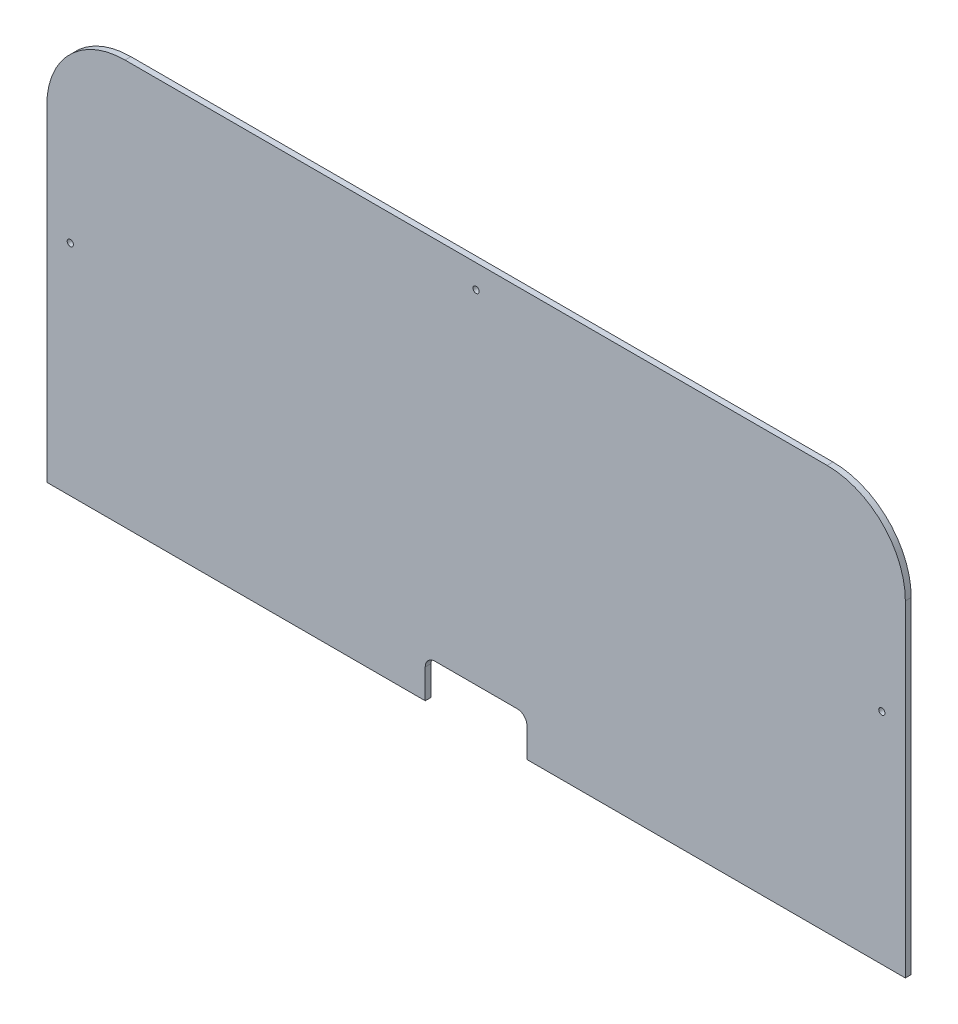
ISO-10303-21;
HEADER;
FILE_DESCRIPTION(('STEP AP214'),'2;1');
FILE_NAME('part.step','',(''),(''),'','','');
FILE_SCHEMA(('AUTOMOTIVE_DESIGN { 1 0 10303 214 1 1 1 1 }'));
ENDSEC;
DATA;
#1=APPLICATION_CONTEXT('core data for automotive mechanical design processes');
#2=APPLICATION_PROTOCOL_DEFINITION('international standard','automotive_design',2000,#1);
#3=PRODUCT_CONTEXT('',#1,'mechanical');
#4=PRODUCT('Part','Part','',(#3));
#5=PRODUCT_RELATED_PRODUCT_CATEGORY('part','',(#4));
#6=PRODUCT_DEFINITION_FORMATION('','',#4);
#7=PRODUCT_DEFINITION_CONTEXT('part definition',#1,'design');
#8=PRODUCT_DEFINITION('design','',#6,#7);
#9=PRODUCT_DEFINITION_SHAPE('','',#8);
#10=(LENGTH_UNIT() NAMED_UNIT(*) SI_UNIT(.MILLI.,.METRE.));
#11=(NAMED_UNIT(*) PLANE_ANGLE_UNIT() SI_UNIT($,.RADIAN.));
#12=(NAMED_UNIT(*) SI_UNIT($,.STERADIAN.) SOLID_ANGLE_UNIT());
#13=UNCERTAINTY_MEASURE_WITH_UNIT(LENGTH_MEASURE(1.E-05),#10,'distance_accuracy_value','');
#14=(GEOMETRIC_REPRESENTATION_CONTEXT(3) GLOBAL_UNCERTAINTY_ASSIGNED_CONTEXT((#13)) GLOBAL_UNIT_ASSIGNED_CONTEXT((#10,
#11,#12)) REPRESENTATION_CONTEXT('',''));
#15=CARTESIAN_POINT('',(0.,0.,0.));
#16=DIRECTION('',(0.,0.,1.));
#17=DIRECTION('',(1.,0.,0.));
#18=AXIS2_PLACEMENT_3D('',#15,#16,#17);
#19=CARTESIAN_POINT('',(-219.5,-103.5,3.));
#20=DIRECTION('',(0.,1.,0.));
#21=DIRECTION('',(0.,0.,1.));
#22=AXIS2_PLACEMENT_3D('',#19,#20,#21);
#23=PLANE('',#22);
#24=DIRECTION('',(1.,0.,0.));
#25=VECTOR('',#24,1.);
#26=CARTESIAN_POINT('',(-219.5,-103.5,0.));
#27=LINE('',#26,#25);
#28=CARTESIAN_POINT('',(-219.5,-103.5,0.));
#29=VERTEX_POINT('',#28);
#30=CARTESIAN_POINT('',(-26.,-103.5,0.));
#31=VERTEX_POINT('',#30);
#32=EDGE_CURVE('E180',#29,#31,#27,.T.);
#33=ORIENTED_EDGE('',*,*,#32,.T.);
#34=DIRECTION('',(0.,0.,-1.));
#35=VECTOR('',#34,1.);
#36=CARTESIAN_POINT('',(-26.,-103.5,3.));
#37=LINE('',#36,#35);
#38=CARTESIAN_POINT('',(-26.,-103.5,3.));
#39=VERTEX_POINT('',#38);
#40=EDGE_CURVE('E166',#39,#31,#37,.T.);
#41=ORIENTED_EDGE('',*,*,#40,.F.);
#42=DIRECTION('',(1.,0.,0.));
#43=VECTOR('',#42,1.);
#44=CARTESIAN_POINT('',(-219.5,-103.5,3.));
#45=LINE('',#44,#43);
#46=CARTESIAN_POINT('',(-219.5,-103.5,3.));
#47=VERTEX_POINT('',#46);
#48=EDGE_CURVE('E142',#47,#39,#45,.T.);
#49=ORIENTED_EDGE('',*,*,#48,.F.);
#50=DIRECTION('',(0.,0.,-1.));
#51=VECTOR('',#50,1.);
#52=CARTESIAN_POINT('',(-219.5,-103.5,3.));
#53=LINE('',#52,#51);
#54=EDGE_CURVE('E199',#47,#29,#53,.T.);
#55=ORIENTED_EDGE('',*,*,#54,.T.);
#56=EDGE_LOOP('',(#33,#41,#49,#55));
#57=FACE_BOUND('',#56,.T.);
#58=ADVANCED_FACE('F33',(#57),#23,.F.);
#59=CARTESIAN_POINT('',(219.5,103.5,3.));
#60=DIRECTION('',(-1.,0.,0.));
#61=DIRECTION('',(0.,-1.,0.));
#62=AXIS2_PLACEMENT_3D('',#59,#60,#61);
#63=PLANE('',#62);
#64=DIRECTION('',(0.,1.,0.));
#65=VECTOR('',#64,1.);
#66=CARTESIAN_POINT('',(219.5,103.5,0.));
#67=LINE('',#66,#65);
#68=CARTESIAN_POINT('',(219.5,-103.5,0.));
#69=VERTEX_POINT('',#68);
#70=CARTESIAN_POINT('',(219.5,63.5,0.));
#71=VERTEX_POINT('',#70);
#72=EDGE_CURVE('E168',#69,#71,#67,.T.);
#73=ORIENTED_EDGE('',*,*,#72,.T.);
#74=DIRECTION('',(0.,0.,-1.));
#75=VECTOR('',#74,1.);
#76=CARTESIAN_POINT('',(219.5,63.5,3.));
#77=LINE('',#76,#75);
#78=CARTESIAN_POINT('',(219.5,63.5,3.));
#79=VERTEX_POINT('',#78);
#80=EDGE_CURVE('E11',#71,#79,#77,.F.);
#81=ORIENTED_EDGE('',*,*,#80,.T.);
#82=DIRECTION('',(0.,1.,0.));
#83=VECTOR('',#82,1.);
#84=CARTESIAN_POINT('',(219.5,103.5,3.));
#85=LINE('',#84,#83);
#86=CARTESIAN_POINT('',(219.5,-103.5,3.));
#87=VERTEX_POINT('',#86);
#88=EDGE_CURVE('E177',#87,#79,#85,.T.);
#89=ORIENTED_EDGE('',*,*,#88,.F.);
#90=DIRECTION('',(0.,0.,-1.));
#91=VECTOR('',#90,1.);
#92=CARTESIAN_POINT('',(219.5,-103.5,3.));
#93=LINE('',#92,#91);
#94=EDGE_CURVE('E187',#87,#69,#93,.T.);
#95=ORIENTED_EDGE('',*,*,#94,.T.);
#96=EDGE_LOOP('',(#73,#81,#89,#95));
#97=FACE_BOUND('',#96,.T.);
#98=ADVANCED_FACE('F237',(#97),#63,.F.);
#99=CARTESIAN_POINT('',(-219.5,103.5,3.));
#100=DIRECTION('',(0.,-1.,0.));
#101=DIRECTION('',(0.,0.,-1.));
#102=AXIS2_PLACEMENT_3D('',#99,#100,#101);
#103=PLANE('',#102);
#104=DIRECTION('',(-1.,0.,0.));
#105=VECTOR('',#104,1.);
#106=CARTESIAN_POINT('',(-219.5,103.5,0.));
#107=LINE('',#106,#105);
#108=CARTESIAN_POINT('',(179.5,103.5,0.));
#109=VERTEX_POINT('',#108);
#110=CARTESIAN_POINT('',(-179.5,103.5,0.));
#111=VERTEX_POINT('',#110);
#112=EDGE_CURVE('E189',#109,#111,#107,.T.);
#113=ORIENTED_EDGE('',*,*,#112,.T.);
#114=DIRECTION('',(0.,0.,-1.));
#115=VECTOR('',#114,1.);
#116=CARTESIAN_POINT('',(-179.5,103.5,3.));
#117=LINE('',#116,#115);
#118=CARTESIAN_POINT('',(-179.5,103.5,3.));
#119=VERTEX_POINT('',#118);
#120=EDGE_CURVE('E212',#111,#119,#117,.F.);
#121=ORIENTED_EDGE('',*,*,#120,.T.);
#122=DIRECTION('',(-1.,0.,0.));
#123=VECTOR('',#122,1.);
#124=CARTESIAN_POINT('',(-219.5,103.5,3.));
#125=LINE('',#124,#123);
#126=CARTESIAN_POINT('',(179.5,103.5,3.));
#127=VERTEX_POINT('',#126);
#128=EDGE_CURVE('E179',#127,#119,#125,.T.);
#129=ORIENTED_EDGE('',*,*,#128,.F.);
#130=DIRECTION('',(0.,0.,-1.));
#131=VECTOR('',#130,1.);
#132=CARTESIAN_POINT('',(179.5,103.5,3.));
#133=LINE('',#132,#131);
#134=EDGE_CURVE('E209',#127,#109,#133,.T.);
#135=ORIENTED_EDGE('',*,*,#134,.T.);
#136=EDGE_LOOP('',(#113,#121,#129,#135));
#137=FACE_BOUND('',#136,.T.);
#138=ADVANCED_FACE('F231',(#137),#103,.F.);
#139=CARTESIAN_POINT('',(-219.5,103.5,3.));
#140=DIRECTION('',(1.,0.,0.));
#141=DIRECTION('',(0.,0.,-1.));
#142=AXIS2_PLACEMENT_3D('',#139,#140,#141);
#143=PLANE('',#142);
#144=DIRECTION('',(0.,-1.,0.));
#145=VECTOR('',#144,1.);
#146=CARTESIAN_POINT('',(-219.5,103.5,3.));
#147=LINE('',#146,#145);
#148=CARTESIAN_POINT('',(-219.5,63.5,3.));
#149=VERTEX_POINT('',#148);
#150=EDGE_CURVE('E183',#149,#47,#147,.T.);
#151=ORIENTED_EDGE('',*,*,#150,.F.);
#152=DIRECTION('',(0.,0.,-1.));
#153=VECTOR('',#152,1.);
#154=CARTESIAN_POINT('',(-219.5,63.5,3.));
#155=LINE('',#154,#153);
#156=CARTESIAN_POINT('',(-219.5,63.5,0.));
#157=VERTEX_POINT('',#156);
#158=EDGE_CURVE('E202',#149,#157,#155,.T.);
#159=ORIENTED_EDGE('',*,*,#158,.T.);
#160=DIRECTION('',(0.,-1.,0.));
#161=VECTOR('',#160,1.);
#162=CARTESIAN_POINT('',(-219.5,103.5,0.));
#163=LINE('',#162,#161);
#164=EDGE_CURVE('E192',#157,#29,#163,.T.);
#165=ORIENTED_EDGE('',*,*,#164,.T.);
#166=ORIENTED_EDGE('',*,*,#54,.F.);
#167=EDGE_LOOP('',(#151,#159,#165,#166));
#168=FACE_BOUND('',#167,.T.);
#169=ADVANCED_FACE('F223',(#168),#143,.F.);
#170=CARTESIAN_POINT('',(26.,-103.5,3.));
#171=VERTEX_POINT('',#170);
#172=EDGE_CURVE('E185',#171,#87,#45,.T.);
#173=ORIENTED_EDGE('',*,*,#172,.F.);
#174=DIRECTION('',(0.,0.,-1.));
#175=VECTOR('',#174,1.);
#176=CARTESIAN_POINT('',(26.,-103.5,3.));
#177=LINE('',#176,#175);
#178=CARTESIAN_POINT('',(26.,-103.5,0.));
#179=VERTEX_POINT('',#178);
#180=EDGE_CURVE('E169',#171,#179,#177,.T.);
#181=ORIENTED_EDGE('',*,*,#180,.T.);
#182=EDGE_CURVE('E194',#179,#69,#27,.T.);
#183=ORIENTED_EDGE('',*,*,#182,.T.);
#184=ORIENTED_EDGE('',*,*,#94,.F.);
#185=EDGE_LOOP('',(#173,#181,#183,#184));
#186=FACE_BOUND('',#185,.T.);
#187=ADVANCED_FACE('F241',(#186),#23,.F.);
#188=CARTESIAN_POINT('',(0.,0.,3.));
#189=DIRECTION('',(0.,0.,1.));
#190=DIRECTION('',(1.,0.,0.));
#191=AXIS2_PLACEMENT_3D('',#188,#189,#190);
#192=PLANE('',#191);
#193=CARTESIAN_POINT('',(-1.41735333110377E-13,91.5000000000001,3.));
#194=DIRECTION('',(0.,0.,1.));
#195=DIRECTION('',(1.,0.,0.));
#196=AXIS2_PLACEMENT_3D('',#193,#194,#195);
#197=CIRCLE('',#196,1.60000000000001);
#198=CARTESIAN_POINT('',(1.59999999999987,91.5000000000001,3.));
#199=VERTEX_POINT('',#198);
#200=EDGE_CURVE('E314',#199,#199,#197,.T.);
#201=ORIENTED_EDGE('',*,*,#200,.F.);
#202=EDGE_LOOP('',(#201));
#203=FACE_BOUND('',#202,.T.);
#204=CARTESIAN_POINT('',(-207.5,8.50000000000006,3.));
#205=DIRECTION('',(0.,0.,1.));
#206=DIRECTION('',(1.,0.,0.));
#207=AXIS2_PLACEMENT_3D('',#204,#205,#206);
#208=CIRCLE('',#207,1.59999999999999);
#209=CARTESIAN_POINT('',(-205.9,8.50000000000006,3.));
#210=VERTEX_POINT('',#209);
#211=EDGE_CURVE('E320',#210,#210,#208,.T.);
#212=ORIENTED_EDGE('',*,*,#211,.F.);
#213=EDGE_LOOP('',(#212));
#214=FACE_BOUND('',#213,.T.);
#215=CARTESIAN_POINT('',(207.499999999999,8.50000000000012,3.));
#216=DIRECTION('',(0.,0.,1.));
#217=DIRECTION('',(1.,0.,0.));
#218=AXIS2_PLACEMENT_3D('',#215,#216,#217);
#219=CIRCLE('',#218,1.59999999999999);
#220=CARTESIAN_POINT('',(209.099999999999,8.50000000000012,3.));
#221=VERTEX_POINT('',#220);
#222=EDGE_CURVE('E148',#221,#221,#219,.T.);
#223=ORIENTED_EDGE('',*,*,#222,.F.);
#224=EDGE_LOOP('',(#223));
#225=FACE_BOUND('',#224,.T.);
#226=DIRECTION('',(0.,1.,0.));
#227=VECTOR('',#226,1.);
#228=CARTESIAN_POINT('',(-26.,-88.5,3.));
#229=LINE('',#228,#227);
#230=CARTESIAN_POINT('',(-26.,-88.5,3.));
#231=VERTEX_POINT('',#230);
#232=EDGE_CURVE('E123',#39,#231,#229,.T.);
#233=ORIENTED_EDGE('',*,*,#232,.T.);
#234=CARTESIAN_POINT('',(-21.,-88.5,3.));
#235=DIRECTION('',(0.,0.,-1.));
#236=DIRECTION('',(1.,0.,0.));
#237=AXIS2_PLACEMENT_3D('',#234,#235,#236);
#238=CIRCLE('',#237,5.);
#239=CARTESIAN_POINT('',(-21.,-83.5,3.));
#240=VERTEX_POINT('',#239);
#241=EDGE_CURVE('E132',#231,#240,#238,.T.);
#242=ORIENTED_EDGE('',*,*,#241,.T.);
#243=DIRECTION('',(1.,0.,0.));
#244=VECTOR('',#243,1.);
#245=CARTESIAN_POINT('',(21.,-83.5,3.));
#246=LINE('',#245,#244);
#247=CARTESIAN_POINT('',(21.,-83.5,3.));
#248=VERTEX_POINT('',#247);
#249=EDGE_CURVE('E137',#240,#248,#246,.T.);
#250=ORIENTED_EDGE('',*,*,#249,.T.);
#251=CARTESIAN_POINT('',(21.,-88.5,3.));
#252=DIRECTION('',(0.,0.,-1.));
#253=DIRECTION('',(-1.,0.,0.));
#254=AXIS2_PLACEMENT_3D('',#251,#252,#253);
#255=CIRCLE('',#254,5.);
#256=CARTESIAN_POINT('',(26.,-88.5,3.));
#257=VERTEX_POINT('',#256);
#258=EDGE_CURVE('E152',#248,#257,#255,.T.);
#259=ORIENTED_EDGE('',*,*,#258,.T.);
#260=DIRECTION('',(0.,-1.,0.));
#261=VECTOR('',#260,1.);
#262=CARTESIAN_POINT('',(26.,-88.5,3.));
#263=LINE('',#262,#261);
#264=EDGE_CURVE('E129',#257,#171,#263,.T.);
#265=ORIENTED_EDGE('',*,*,#264,.T.);
#266=ORIENTED_EDGE('',*,*,#172,.T.);
#267=ORIENTED_EDGE('',*,*,#88,.T.);
#268=CARTESIAN_POINT('',(179.5,63.5,3.));
#269=DIRECTION('',(0.,0.,1.));
#270=DIRECTION('',(1.,0.,0.));
#271=AXIS2_PLACEMENT_3D('',#268,#269,#270);
#272=CIRCLE('',#271,40.);
#273=EDGE_CURVE('E214',#79,#127,#272,.T.);
#274=ORIENTED_EDGE('',*,*,#273,.T.);
#275=ORIENTED_EDGE('',*,*,#128,.T.);
#276=CARTESIAN_POINT('',(-179.5,63.5,3.));
#277=DIRECTION('',(0.,0.,1.));
#278=DIRECTION('',(1.,0.,0.));
#279=AXIS2_PLACEMENT_3D('',#276,#277,#278);
#280=CIRCLE('',#279,40.);
#281=EDGE_CURVE('E41',#119,#149,#280,.T.);
#282=ORIENTED_EDGE('',*,*,#281,.T.);
#283=ORIENTED_EDGE('',*,*,#150,.T.);
#284=ORIENTED_EDGE('',*,*,#48,.T.);
#285=EDGE_LOOP('',(#233,#242,#250,#259,#265,#266,#267,#274,#275,#282,#283,#284));
#286=FACE_BOUND('',#285,.T.);
#287=ADVANCED_FACE('F140',(#203,#214,#225,#286),#192,.T.);
#288=CARTESIAN_POINT('',(0.,0.,0.));
#289=DIRECTION('',(0.,0.,1.));
#290=DIRECTION('',(1.,0.,0.));
#291=AXIS2_PLACEMENT_3D('',#288,#289,#290);
#292=PLANE('',#291);
#293=CARTESIAN_POINT('',(-1.41735333110377E-13,91.5000000000001,0.));
#294=DIRECTION('',(0.,0.,1.));
#295=DIRECTION('',(1.,0.,0.));
#296=AXIS2_PLACEMENT_3D('',#293,#294,#295);
#297=CIRCLE('',#296,1.60000000000001);
#298=CARTESIAN_POINT('',(1.59999999999987,91.5000000000001,0.));
#299=VERTEX_POINT('',#298);
#300=EDGE_CURVE('E311',#299,#299,#297,.T.);
#301=ORIENTED_EDGE('',*,*,#300,.T.);
#302=EDGE_LOOP('',(#301));
#303=FACE_BOUND('',#302,.T.);
#304=CARTESIAN_POINT('',(-207.5,8.50000000000006,0.));
#305=DIRECTION('',(0.,0.,1.));
#306=DIRECTION('',(1.,0.,0.));
#307=AXIS2_PLACEMENT_3D('',#304,#305,#306);
#308=CIRCLE('',#307,1.59999999999999);
#309=CARTESIAN_POINT('',(-205.9,8.50000000000006,0.));
#310=VERTEX_POINT('',#309);
#311=EDGE_CURVE('E159',#310,#310,#308,.T.);
#312=ORIENTED_EDGE('',*,*,#311,.T.);
#313=EDGE_LOOP('',(#312));
#314=FACE_BOUND('',#313,.T.);
#315=CARTESIAN_POINT('',(207.499999999999,8.50000000000012,0.));
#316=DIRECTION('',(0.,0.,1.));
#317=DIRECTION('',(1.,0.,0.));
#318=AXIS2_PLACEMENT_3D('',#315,#316,#317);
#319=CIRCLE('',#318,1.59999999999999);
#320=CARTESIAN_POINT('',(209.099999999999,8.50000000000012,0.));
#321=VERTEX_POINT('',#320);
#322=EDGE_CURVE('E322',#321,#321,#319,.T.);
#323=ORIENTED_EDGE('',*,*,#322,.T.);
#324=EDGE_LOOP('',(#323));
#325=FACE_BOUND('',#324,.T.);
#326=CARTESIAN_POINT('',(-21.,-88.5,0.));
#327=DIRECTION('',(0.,0.,-1.));
#328=DIRECTION('',(1.,0.,0.));
#329=AXIS2_PLACEMENT_3D('',#326,#327,#328);
#330=CIRCLE('',#329,5.);
#331=CARTESIAN_POINT('',(-26.,-88.5,0.));
#332=VERTEX_POINT('',#331);
#333=CARTESIAN_POINT('',(-21.,-83.5,0.));
#334=VERTEX_POINT('',#333);
#335=EDGE_CURVE('E158',#332,#334,#330,.T.);
#336=ORIENTED_EDGE('',*,*,#335,.F.);
#337=DIRECTION('',(0.,1.,0.));
#338=VECTOR('',#337,1.);
#339=CARTESIAN_POINT('',(-26.,-88.5,0.));
#340=LINE('',#339,#338);
#341=EDGE_CURVE('E48',#31,#332,#340,.T.);
#342=ORIENTED_EDGE('',*,*,#341,.F.);
#343=ORIENTED_EDGE('',*,*,#32,.F.);
#344=ORIENTED_EDGE('',*,*,#164,.F.);
#345=CARTESIAN_POINT('',(-179.5,63.5,0.));
#346=DIRECTION('',(0.,0.,1.));
#347=DIRECTION('',(1.,0.,0.));
#348=AXIS2_PLACEMENT_3D('',#345,#346,#347);
#349=CIRCLE('',#348,40.);
#350=EDGE_CURVE('E207',#157,#111,#349,.F.);
#351=ORIENTED_EDGE('',*,*,#350,.T.);
#352=ORIENTED_EDGE('',*,*,#112,.F.);
#353=CARTESIAN_POINT('',(179.5,63.5,0.));
#354=DIRECTION('',(0.,0.,1.));
#355=DIRECTION('',(1.,0.,0.));
#356=AXIS2_PLACEMENT_3D('',#353,#354,#355);
#357=CIRCLE('',#356,40.);
#358=EDGE_CURVE('E205',#109,#71,#357,.F.);
#359=ORIENTED_EDGE('',*,*,#358,.T.);
#360=ORIENTED_EDGE('',*,*,#72,.F.);
#361=ORIENTED_EDGE('',*,*,#182,.F.);
#362=DIRECTION('',(0.,-1.,0.));
#363=VECTOR('',#362,1.);
#364=CARTESIAN_POINT('',(26.,-88.5,0.));
#365=LINE('',#364,#363);
#366=CARTESIAN_POINT('',(26.,-88.5,0.));
#367=VERTEX_POINT('',#366);
#368=EDGE_CURVE('E143',#367,#179,#365,.T.);
#369=ORIENTED_EDGE('',*,*,#368,.F.);
#370=CARTESIAN_POINT('',(21.,-88.5,0.));
#371=DIRECTION('',(0.,0.,-1.));
#372=DIRECTION('',(-1.,0.,0.));
#373=AXIS2_PLACEMENT_3D('',#370,#371,#372);
#374=CIRCLE('',#373,5.);
#375=CARTESIAN_POINT('',(21.,-83.5,0.));
#376=VERTEX_POINT('',#375);
#377=EDGE_CURVE('E145',#376,#367,#374,.T.);
#378=ORIENTED_EDGE('',*,*,#377,.F.);
#379=DIRECTION('',(1.,0.,0.));
#380=VECTOR('',#379,1.);
#381=CARTESIAN_POINT('',(21.,-83.5,0.));
#382=LINE('',#381,#380);
#383=EDGE_CURVE('E161',#334,#376,#382,.T.);
#384=ORIENTED_EDGE('',*,*,#383,.F.);
#385=EDGE_LOOP('',(#336,#342,#343,#344,#351,#352,#359,#360,#361,#369,#378,#384));
#386=FACE_BOUND('',#385,.T.);
#387=ADVANCED_FACE('F228',(#303,#314,#325,#386),#292,.F.);
#388=CARTESIAN_POINT('',(-179.5,63.5,3.));
#389=DIRECTION('',(0.,0.,-1.));
#390=DIRECTION('',(-1.,0.,0.));
#391=AXIS2_PLACEMENT_3D('',#388,#389,#390);
#392=CYLINDRICAL_SURFACE('',#391,40.);
#393=ORIENTED_EDGE('',*,*,#281,.F.);
#394=ORIENTED_EDGE('',*,*,#120,.F.);
#395=ORIENTED_EDGE('',*,*,#350,.F.);
#396=ORIENTED_EDGE('',*,*,#158,.F.);
#397=EDGE_LOOP('',(#393,#394,#395,#396));
#398=FACE_BOUND('',#397,.T.);
#399=ADVANCED_FACE('F225',(#398),#392,.T.);
#400=CARTESIAN_POINT('',(179.5,63.5,3.));
#401=DIRECTION('',(0.,0.,-1.));
#402=DIRECTION('',(-1.,0.,0.));
#403=AXIS2_PLACEMENT_3D('',#400,#401,#402);
#404=CYLINDRICAL_SURFACE('',#403,40.);
#405=ORIENTED_EDGE('',*,*,#273,.F.);
#406=ORIENTED_EDGE('',*,*,#80,.F.);
#407=ORIENTED_EDGE('',*,*,#358,.F.);
#408=ORIENTED_EDGE('',*,*,#134,.F.);
#409=EDGE_LOOP('',(#405,#406,#407,#408));
#410=FACE_BOUND('',#409,.T.);
#411=ADVANCED_FACE('F35',(#410),#404,.T.);
#412=CARTESIAN_POINT('',(-26.,-88.5,3.));
#413=DIRECTION('',(-1.,0.,0.));
#414=DIRECTION('',(0.,-1.,0.));
#415=AXIS2_PLACEMENT_3D('',#412,#413,#414);
#416=PLANE('',#415);
#417=ORIENTED_EDGE('',*,*,#341,.T.);
#418=DIRECTION('',(0.,0.,-1.));
#419=VECTOR('',#418,1.);
#420=CARTESIAN_POINT('',(-26.,-88.5,3.));
#421=LINE('',#420,#419);
#422=EDGE_CURVE('E119',#231,#332,#421,.T.);
#423=ORIENTED_EDGE('',*,*,#422,.F.);
#424=ORIENTED_EDGE('',*,*,#232,.F.);
#425=ORIENTED_EDGE('',*,*,#40,.T.);
#426=EDGE_LOOP('',(#417,#423,#424,#425));
#427=FACE_BOUND('',#426,.T.);
#428=ADVANCED_FACE('F121',(#427),#416,.F.);
#429=CARTESIAN_POINT('',(26.,-88.5,3.));
#430=DIRECTION('',(1.,0.,0.));
#431=DIRECTION('',(0.,1.,0.));
#432=AXIS2_PLACEMENT_3D('',#429,#430,#431);
#433=PLANE('',#432);
#434=ORIENTED_EDGE('',*,*,#368,.T.);
#435=ORIENTED_EDGE('',*,*,#180,.F.);
#436=ORIENTED_EDGE('',*,*,#264,.F.);
#437=DIRECTION('',(0.,0.,-1.));
#438=VECTOR('',#437,1.);
#439=CARTESIAN_POINT('',(26.,-88.5,3.));
#440=LINE('',#439,#438);
#441=EDGE_CURVE('E172',#257,#367,#440,.T.);
#442=ORIENTED_EDGE('',*,*,#441,.T.);
#443=EDGE_LOOP('',(#434,#435,#436,#442));
#444=FACE_BOUND('',#443,.T.);
#445=ADVANCED_FACE('F246',(#444),#433,.F.);
#446=CARTESIAN_POINT('',(21.,-88.5,3.));
#447=DIRECTION('',(0.,0.,-1.));
#448=DIRECTION('',(-1.,0.,0.));
#449=AXIS2_PLACEMENT_3D('',#446,#447,#448);
#450=CYLINDRICAL_SURFACE('',#449,5.);
#451=ORIENTED_EDGE('',*,*,#377,.T.);
#452=ORIENTED_EDGE('',*,*,#441,.F.);
#453=ORIENTED_EDGE('',*,*,#258,.F.);
#454=DIRECTION('',(0.,0.,-1.));
#455=VECTOR('',#454,1.);
#456=CARTESIAN_POINT('',(21.,-83.5,3.));
#457=LINE('',#456,#455);
#458=EDGE_CURVE('E174',#248,#376,#457,.T.);
#459=ORIENTED_EDGE('',*,*,#458,.T.);
#460=EDGE_LOOP('',(#451,#452,#453,#459));
#461=FACE_BOUND('',#460,.T.);
#462=ADVANCED_FACE('F250',(#461),#450,.F.);
#463=CARTESIAN_POINT('',(21.,-83.5,3.));
#464=DIRECTION('',(0.,1.,0.));
#465=DIRECTION('',(0.,0.,1.));
#466=AXIS2_PLACEMENT_3D('',#463,#464,#465);
#467=PLANE('',#466);
#468=ORIENTED_EDGE('',*,*,#383,.T.);
#469=ORIENTED_EDGE('',*,*,#458,.F.);
#470=ORIENTED_EDGE('',*,*,#249,.F.);
#471=DIRECTION('',(0.,0.,-1.));
#472=VECTOR('',#471,1.);
#473=CARTESIAN_POINT('',(-21.,-83.5,3.));
#474=LINE('',#473,#472);
#475=EDGE_CURVE('E128',#240,#334,#474,.T.);
#476=ORIENTED_EDGE('',*,*,#475,.T.);
#477=EDGE_LOOP('',(#468,#469,#470,#476));
#478=FACE_BOUND('',#477,.T.);
#479=ADVANCED_FACE('F252',(#478),#467,.F.);
#480=CARTESIAN_POINT('',(-21.,-88.5,3.));
#481=DIRECTION('',(0.,0.,-1.));
#482=DIRECTION('',(-1.,0.,0.));
#483=AXIS2_PLACEMENT_3D('',#480,#481,#482);
#484=CYLINDRICAL_SURFACE('',#483,5.);
#485=ORIENTED_EDGE('',*,*,#335,.T.);
#486=ORIENTED_EDGE('',*,*,#475,.F.);
#487=ORIENTED_EDGE('',*,*,#241,.F.);
#488=ORIENTED_EDGE('',*,*,#422,.T.);
#489=EDGE_LOOP('',(#485,#486,#487,#488));
#490=FACE_BOUND('',#489,.T.);
#491=ADVANCED_FACE('F133',(#490),#484,.F.);
#492=CARTESIAN_POINT('',(207.499999999999,8.50000000000012,0.));
#493=DIRECTION('',(0.,0.,1.));
#494=DIRECTION('',(1.,0.,0.));
#495=AXIS2_PLACEMENT_3D('',#492,#493,#494);
#496=CYLINDRICAL_SURFACE('',#495,1.59999999999999);
#497=ORIENTED_EDGE('',*,*,#322,.F.);
#498=EDGE_LOOP('',(#497));
#499=FACE_BOUND('',#498,.T.);
#500=ORIENTED_EDGE('',*,*,#222,.T.);
#501=EDGE_LOOP('',(#500));
#502=FACE_BOUND('',#501,.T.);
#503=ADVANCED_FACE('F291',(#499,#502),#496,.F.);
#504=CARTESIAN_POINT('',(-207.5,8.50000000000006,0.));
#505=DIRECTION('',(0.,0.,1.));
#506=DIRECTION('',(1.,0.,0.));
#507=AXIS2_PLACEMENT_3D('',#504,#505,#506);
#508=CYLINDRICAL_SURFACE('',#507,1.59999999999999);
#509=ORIENTED_EDGE('',*,*,#311,.F.);
#510=EDGE_LOOP('',(#509));
#511=FACE_BOUND('',#510,.T.);
#512=ORIENTED_EDGE('',*,*,#211,.T.);
#513=EDGE_LOOP('',(#512));
#514=FACE_BOUND('',#513,.T.);
#515=ADVANCED_FACE('F300',(#511,#514),#508,.F.);
#516=CARTESIAN_POINT('',(-1.41735333110377E-13,91.5000000000001,0.));
#517=DIRECTION('',(0.,0.,1.));
#518=DIRECTION('',(1.,0.,0.));
#519=AXIS2_PLACEMENT_3D('',#516,#517,#518);
#520=CYLINDRICAL_SURFACE('',#519,1.60000000000001);
#521=ORIENTED_EDGE('',*,*,#300,.F.);
#522=EDGE_LOOP('',(#521));
#523=FACE_BOUND('',#522,.T.);
#524=ORIENTED_EDGE('',*,*,#200,.T.);
#525=EDGE_LOOP('',(#524));
#526=FACE_BOUND('',#525,.T.);
#527=ADVANCED_FACE('F304',(#523,#526),#520,.F.);
#528=CLOSED_SHELL('',(#58,#98,#138,#169,#187,#287,#387,#399,#411,#428,#445,#462,#479,#491,#503,
#515,#527));
#529=MANIFOLD_SOLID_BREP('B2',#528);
#530=ADVANCED_BREP_SHAPE_REPRESENTATION('',(#18,#529),#14);
#531=SHAPE_DEFINITION_REPRESENTATION(#9,#530);
ENDSEC;
END-ISO-10303-21;
